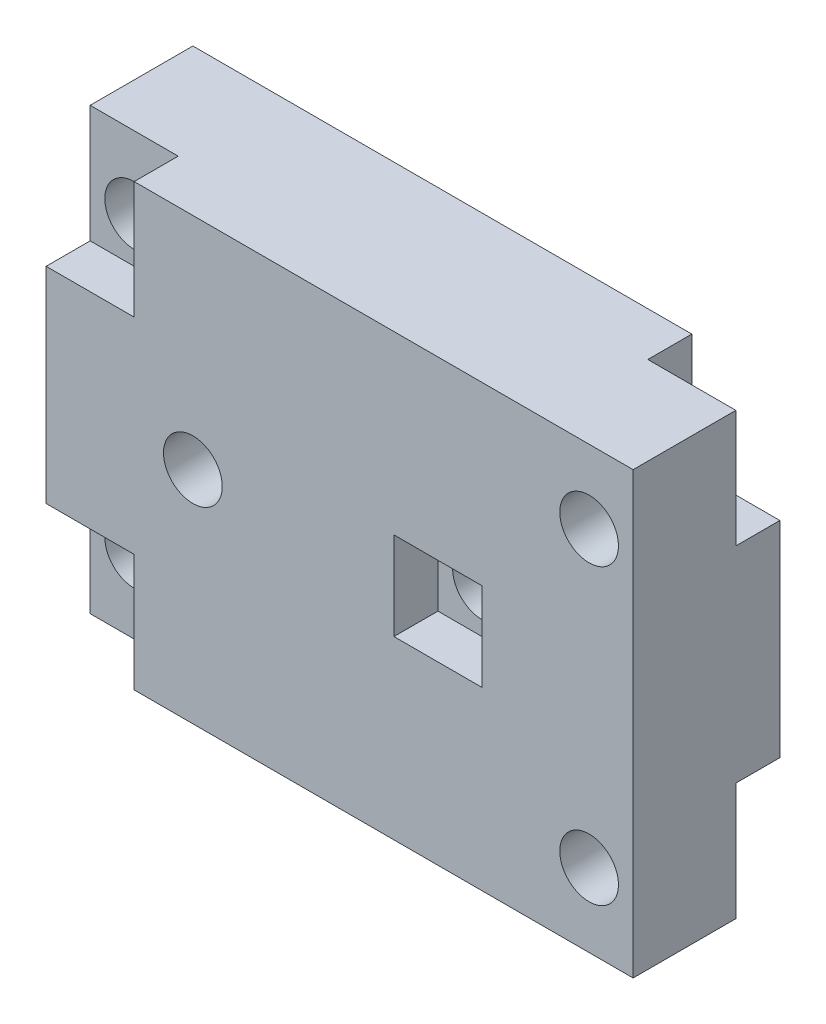
ISO-10303-21;
HEADER;
FILE_DESCRIPTION(('STEP AP214'),'2;1');
FILE_NAME('part.step','',(''),(''),'','','');
FILE_SCHEMA(('AUTOMOTIVE_DESIGN { 1 0 10303 214 1 1 1 1 }'));
ENDSEC;
DATA;
#1=APPLICATION_CONTEXT('core data for automotive mechanical design processes');
#2=APPLICATION_PROTOCOL_DEFINITION('international standard','automotive_design',2000,#1);
#3=PRODUCT_CONTEXT('',#1,'mechanical');
#4=PRODUCT('Part','Part','',(#3));
#5=PRODUCT_RELATED_PRODUCT_CATEGORY('part','',(#4));
#6=PRODUCT_DEFINITION_FORMATION('','',#4);
#7=PRODUCT_DEFINITION_CONTEXT('part definition',#1,'design');
#8=PRODUCT_DEFINITION('design','',#6,#7);
#9=PRODUCT_DEFINITION_SHAPE('','',#8);
#10=(LENGTH_UNIT() NAMED_UNIT(*) SI_UNIT(.MILLI.,.METRE.));
#11=(NAMED_UNIT(*) PLANE_ANGLE_UNIT() SI_UNIT($,.RADIAN.));
#12=(NAMED_UNIT(*) SI_UNIT($,.STERADIAN.) SOLID_ANGLE_UNIT());
#13=UNCERTAINTY_MEASURE_WITH_UNIT(LENGTH_MEASURE(1.E-05),#10,'distance_accuracy_value','');
#14=(GEOMETRIC_REPRESENTATION_CONTEXT(3) GLOBAL_UNCERTAINTY_ASSIGNED_CONTEXT((#13)) GLOBAL_UNIT_ASSIGNED_CONTEXT((#10,
#11,#12)) REPRESENTATION_CONTEXT('',''));
#15=CARTESIAN_POINT('',(0.,0.,0.));
#16=DIRECTION('',(0.,0.,1.));
#17=DIRECTION('',(1.,0.,0.));
#18=AXIS2_PLACEMENT_3D('',#15,#16,#17);
#19=CARTESIAN_POINT('',(37.,5.,7.));
#20=DIRECTION('',(0.,0.,-1.));
#21=DIRECTION('',(-1.,0.,0.));
#22=AXIS2_PLACEMENT_3D('',#19,#20,#21);
#23=CYLINDRICAL_SURFACE('',#22,2.);
#24=CARTESIAN_POINT('',(37.,5.,5.));
#25=DIRECTION('',(0.,0.,-1.));
#26=DIRECTION('',(-1.,0.,0.));
#27=AXIS2_PLACEMENT_3D('',#24,#25,#26);
#28=CIRCLE('',#27,2.);
#29=CARTESIAN_POINT('',(35.,5.,5.));
#30=VERTEX_POINT('',#29);
#31=EDGE_CURVE('E440',#30,#30,#28,.T.);
#32=ORIENTED_EDGE('',*,*,#31,.F.);
#33=EDGE_LOOP('',(#32));
#34=FACE_BOUND('',#33,.T.);
#35=CARTESIAN_POINT('',(37.,5.,-2.));
#36=DIRECTION('',(0.,0.,-1.));
#37=DIRECTION('',(-1.,0.,0.));
#38=AXIS2_PLACEMENT_3D('',#35,#36,#37);
#39=CIRCLE('',#38,2.);
#40=CARTESIAN_POINT('',(35.,5.,-2.));
#41=VERTEX_POINT('',#40);
#42=EDGE_CURVE('E446',#41,#41,#39,.F.);
#43=ORIENTED_EDGE('',*,*,#42,.F.);
#44=EDGE_LOOP('',(#43));
#45=FACE_BOUND('',#44,.T.);
#46=ADVANCED_FACE('F78',(#34,#45),#23,.F.);
#47=CARTESIAN_POINT('',(3.,25.,0.));
#48=DIRECTION('',(0.,0.,1.));
#49=DIRECTION('',(1.,0.,0.));
#50=AXIS2_PLACEMENT_3D('',#47,#48,#49);
#51=CYLINDRICAL_SURFACE('',#50,2.);
#52=CARTESIAN_POINT('',(3.,25.,2.));
#53=DIRECTION('',(0.,0.,1.));
#54=DIRECTION('',(1.,0.,0.));
#55=AXIS2_PLACEMENT_3D('',#52,#53,#54);
#56=CIRCLE('',#55,2.);
#57=CARTESIAN_POINT('',(5.,25.,2.));
#58=VERTEX_POINT('',#57);
#59=EDGE_CURVE('E389',#58,#58,#56,.F.);
#60=ORIENTED_EDGE('',*,*,#59,.F.);
#61=EDGE_LOOP('',(#60));
#62=FACE_BOUND('',#61,.T.);
#63=CARTESIAN_POINT('',(3.,25.,-5.));
#64=DIRECTION('',(0.,0.,-1.));
#65=DIRECTION('',(-1.,0.,0.));
#66=AXIS2_PLACEMENT_3D('',#63,#64,#65);
#67=CIRCLE('',#66,2.);
#68=CARTESIAN_POINT('',(1.,25.,-5.));
#69=VERTEX_POINT('',#68);
#70=EDGE_CURVE('E347',#69,#69,#67,.F.);
#71=ORIENTED_EDGE('',*,*,#70,.F.);
#72=EDGE_LOOP('',(#71));
#73=FACE_BOUND('',#72,.T.);
#74=ADVANCED_FACE('F473',(#62,#73),#51,.F.);
#75=CARTESIAN_POINT('',(26.7,15.,0.));
#76=DIRECTION('',(0.,0.,1.));
#77=DIRECTION('',(1.,0.,0.));
#78=AXIS2_PLACEMENT_3D('',#75,#76,#77);
#79=CYLINDRICAL_SURFACE('',#78,2.);
#80=CARTESIAN_POINT('',(26.7,15.,2.));
#81=DIRECTION('',(0.,0.,1.));
#82=DIRECTION('',(1.,0.,0.));
#83=AXIS2_PLACEMENT_3D('',#80,#81,#82);
#84=CIRCLE('',#83,2.);
#85=CARTESIAN_POINT('',(28.7,15.,2.));
#86=VERTEX_POINT('',#85);
#87=EDGE_CURVE('E392',#86,#86,#84,.F.);
#88=ORIENTED_EDGE('',*,*,#87,.F.);
#89=EDGE_LOOP('',(#88));
#90=FACE_BOUND('',#89,.T.);
#91=CARTESIAN_POINT('',(26.7,15.,-5.));
#92=DIRECTION('',(0.,0.,-1.));
#93=DIRECTION('',(-1.,0.,0.));
#94=AXIS2_PLACEMENT_3D('',#91,#92,#93);
#95=CIRCLE('',#94,2.);
#96=CARTESIAN_POINT('',(24.7,15.,-5.));
#97=VERTEX_POINT('',#96);
#98=EDGE_CURVE('E351',#97,#97,#95,.F.);
#99=ORIENTED_EDGE('',*,*,#98,.F.);
#100=EDGE_LOOP('',(#99));
#101=FACE_BOUND('',#100,.T.);
#102=ADVANCED_FACE('F479',(#90,#101),#79,.F.);
#103=CARTESIAN_POINT('',(3.,5.,0.));
#104=DIRECTION('',(0.,0.,1.));
#105=DIRECTION('',(1.,0.,0.));
#106=AXIS2_PLACEMENT_3D('',#103,#104,#105);
#107=CYLINDRICAL_SURFACE('',#106,2.);
#108=CARTESIAN_POINT('',(3.,5.,2.));
#109=DIRECTION('',(0.,0.,1.));
#110=DIRECTION('',(1.,0.,0.));
#111=AXIS2_PLACEMENT_3D('',#108,#109,#110);
#112=CIRCLE('',#111,2.);
#113=CARTESIAN_POINT('',(5.,5.,2.));
#114=VERTEX_POINT('',#113);
#115=EDGE_CURVE('E377',#114,#114,#112,.F.);
#116=ORIENTED_EDGE('',*,*,#115,.F.);
#117=EDGE_LOOP('',(#116));
#118=FACE_BOUND('',#117,.T.);
#119=CARTESIAN_POINT('',(3.,5.,-5.));
#120=DIRECTION('',(0.,0.,-1.));
#121=DIRECTION('',(-1.,0.,0.));
#122=AXIS2_PLACEMENT_3D('',#119,#120,#121);
#123=CIRCLE('',#122,2.);
#124=CARTESIAN_POINT('',(1.,5.,-5.));
#125=VERTEX_POINT('',#124);
#126=EDGE_CURVE('E344',#125,#125,#123,.F.);
#127=ORIENTED_EDGE('',*,*,#126,.F.);
#128=EDGE_LOOP('',(#127));
#129=FACE_BOUND('',#128,.T.);
#130=ADVANCED_FACE('F521',(#118,#129),#107,.F.);
#131=CARTESIAN_POINT('',(40.,0.,5.));
#132=DIRECTION('',(0.,1.,0.));
#133=DIRECTION('',(0.,0.,1.));
#134=AXIS2_PLACEMENT_3D('',#131,#132,#133);
#135=PLANE('',#134);
#136=DIRECTION('',(-1.,0.,0.));
#137=VECTOR('',#136,1.);
#138=CARTESIAN_POINT('',(40.,0.,-5.));
#139=LINE('',#138,#137);
#140=CARTESIAN_POINT('',(34.,0.,-5.));
#141=VERTEX_POINT('',#140);
#142=CARTESIAN_POINT('',(0.,0.,-5.));
#143=VERTEX_POINT('',#142);
#144=EDGE_CURVE('E357',#141,#143,#139,.T.);
#145=ORIENTED_EDGE('',*,*,#144,.F.);
#146=DIRECTION('',(0.,0.,-1.));
#147=VECTOR('',#146,1.);
#148=CARTESIAN_POINT('',(34.,0.,-2.));
#149=LINE('',#148,#147);
#150=CARTESIAN_POINT('',(34.,0.,-2.));
#151=VERTEX_POINT('',#150);
#152=EDGE_CURVE('E308',#151,#141,#149,.T.);
#153=ORIENTED_EDGE('',*,*,#152,.F.);
#154=DIRECTION('',(-1.,0.,0.));
#155=VECTOR('',#154,1.);
#156=CARTESIAN_POINT('',(40.,0.,-2.));
#157=LINE('',#156,#155);
#158=CARTESIAN_POINT('',(40.,0.,-2.));
#159=VERTEX_POINT('',#158);
#160=EDGE_CURVE('E296',#159,#151,#157,.T.);
#161=ORIENTED_EDGE('',*,*,#160,.F.);
#162=DIRECTION('',(0.,0.,-1.));
#163=VECTOR('',#162,1.);
#164=CARTESIAN_POINT('',(40.,0.,5.));
#165=LINE('',#164,#163);
#166=CARTESIAN_POINT('',(40.,0.,5.));
#167=VERTEX_POINT('',#166);
#168=EDGE_CURVE('E12',#167,#159,#165,.T.);
#169=ORIENTED_EDGE('',*,*,#168,.F.);
#170=DIRECTION('',(1.,0.,0.));
#171=VECTOR('',#170,1.);
#172=CARTESIAN_POINT('',(40.,0.,5.));
#173=LINE('',#172,#171);
#174=CARTESIAN_POINT('',(6.,0.,5.));
#175=VERTEX_POINT('',#174);
#176=EDGE_CURVE('E402',#175,#167,#173,.T.);
#177=ORIENTED_EDGE('',*,*,#176,.F.);
#178=DIRECTION('',(0.,0.,1.));
#179=VECTOR('',#178,1.);
#180=CARTESIAN_POINT('',(6.,0.,2.5));
#181=LINE('',#180,#179);
#182=CARTESIAN_POINT('',(6.,0.,2.));
#183=VERTEX_POINT('',#182);
#184=EDGE_CURVE('E414',#183,#175,#181,.T.);
#185=ORIENTED_EDGE('',*,*,#184,.F.);
#186=DIRECTION('',(1.,0.,0.));
#187=VECTOR('',#186,1.);
#188=CARTESIAN_POINT('',(0.,0.,2.));
#189=LINE('',#188,#187);
#190=CARTESIAN_POINT('',(0.,0.,2.));
#191=VERTEX_POINT('',#190);
#192=EDGE_CURVE('E382',#191,#183,#189,.T.);
#193=ORIENTED_EDGE('',*,*,#192,.F.);
#194=DIRECTION('',(0.,0.,-1.));
#195=VECTOR('',#194,1.);
#196=CARTESIAN_POINT('',(0.,0.,5.));
#197=LINE('',#196,#195);
#198=EDGE_CURVE('E427',#191,#143,#197,.T.);
#199=ORIENTED_EDGE('',*,*,#198,.T.);
#200=EDGE_LOOP('',(#145,#153,#161,#169,#177,#185,#193,#199));
#201=FACE_BOUND('',#200,.T.);
#202=ADVANCED_FACE('F80',(#201),#135,.F.);
#203=CARTESIAN_POINT('',(40.,30.,5.));
#204=DIRECTION('',(-1.,0.,0.));
#205=DIRECTION('',(0.,0.,1.));
#206=AXIS2_PLACEMENT_3D('',#203,#204,#205);
#207=PLANE('',#206);
#208=DIRECTION('',(0.,-1.,0.));
#209=VECTOR('',#208,1.);
#210=CARTESIAN_POINT('',(40.,30.,-5.));
#211=LINE('',#210,#209);
#212=CARTESIAN_POINT('',(40.,22.,-5.));
#213=VERTEX_POINT('',#212);
#214=CARTESIAN_POINT('',(40.,8.,-5.));
#215=VERTEX_POINT('',#214);
#216=EDGE_CURVE('E354',#213,#215,#211,.T.);
#217=ORIENTED_EDGE('',*,*,#216,.F.);
#218=DIRECTION('',(0.,0.,-1.));
#219=VECTOR('',#218,1.);
#220=CARTESIAN_POINT('',(40.,22.,-2.));
#221=LINE('',#220,#219);
#222=CARTESIAN_POINT('',(40.,22.,-2.));
#223=VERTEX_POINT('',#222);
#224=EDGE_CURVE('E284',#223,#213,#221,.T.);
#225=ORIENTED_EDGE('',*,*,#224,.F.);
#226=DIRECTION('',(0.,-1.,0.));
#227=VECTOR('',#226,1.);
#228=CARTESIAN_POINT('',(40.,22.,-2.));
#229=LINE('',#228,#227);
#230=CARTESIAN_POINT('',(40.,30.,-2.));
#231=VERTEX_POINT('',#230);
#232=EDGE_CURVE('E277',#231,#223,#229,.T.);
#233=ORIENTED_EDGE('',*,*,#232,.F.);
#234=DIRECTION('',(0.,0.,-1.));
#235=VECTOR('',#234,1.);
#236=CARTESIAN_POINT('',(40.,30.,5.));
#237=LINE('',#236,#235);
#238=CARTESIAN_POINT('',(40.,30.,5.));
#239=VERTEX_POINT('',#238);
#240=EDGE_CURVE('E87',#239,#231,#237,.T.);
#241=ORIENTED_EDGE('',*,*,#240,.F.);
#242=DIRECTION('',(0.,1.,0.));
#243=VECTOR('',#242,1.);
#244=CARTESIAN_POINT('',(40.,30.,5.));
#245=LINE('',#244,#243);
#246=EDGE_CURVE('E419',#167,#239,#245,.T.);
#247=ORIENTED_EDGE('',*,*,#246,.F.);
#248=ORIENTED_EDGE('',*,*,#168,.T.);
#249=DIRECTION('',(0.,-1.,0.));
#250=VECTOR('',#249,1.);
#251=CARTESIAN_POINT('',(40.,8.,-2.));
#252=LINE('',#251,#250);
#253=CARTESIAN_POINT('',(40.,8.,-2.));
#254=VERTEX_POINT('',#253);
#255=EDGE_CURVE('E293',#254,#159,#252,.T.);
#256=ORIENTED_EDGE('',*,*,#255,.F.);
#257=DIRECTION('',(0.,0.,-1.));
#258=VECTOR('',#257,1.);
#259=CARTESIAN_POINT('',(40.,8.,-2.));
#260=LINE('',#259,#258);
#261=EDGE_CURVE('E301',#254,#215,#260,.T.);
#262=ORIENTED_EDGE('',*,*,#261,.T.);
#263=EDGE_LOOP('',(#217,#225,#233,#241,#247,#248,#256,#262));
#264=FACE_BOUND('',#263,.T.);
#265=ADVANCED_FACE('F537',(#264),#207,.F.);
#266=CARTESIAN_POINT('',(0.,30.,5.));
#267=DIRECTION('',(0.,-1.,0.));
#268=DIRECTION('',(0.,0.,-1.));
#269=AXIS2_PLACEMENT_3D('',#266,#267,#268);
#270=PLANE('',#269);
#271=DIRECTION('',(1.,0.,0.));
#272=VECTOR('',#271,1.);
#273=CARTESIAN_POINT('',(40.,30.,-2.));
#274=LINE('',#273,#272);
#275=CARTESIAN_POINT('',(34.,30.,-2.));
#276=VERTEX_POINT('',#275);
#277=EDGE_CURVE('E275',#276,#231,#274,.T.);
#278=ORIENTED_EDGE('',*,*,#277,.F.);
#279=DIRECTION('',(0.,0.,-1.));
#280=VECTOR('',#279,1.);
#281=CARTESIAN_POINT('',(34.,30.,-2.));
#282=LINE('',#281,#280);
#283=CARTESIAN_POINT('',(34.,30.,-5.));
#284=VERTEX_POINT('',#283);
#285=EDGE_CURVE('E287',#276,#284,#282,.T.);
#286=ORIENTED_EDGE('',*,*,#285,.T.);
#287=DIRECTION('',(-1.,0.,0.));
#288=VECTOR('',#287,1.);
#289=CARTESIAN_POINT('',(40.,30.,-5.));
#290=LINE('',#289,#288);
#291=CARTESIAN_POINT('',(0.,30.,-5.));
#292=VERTEX_POINT('',#291);
#293=EDGE_CURVE('E362',#284,#292,#290,.T.);
#294=ORIENTED_EDGE('',*,*,#293,.T.);
#295=DIRECTION('',(0.,0.,-1.));
#296=VECTOR('',#295,1.);
#297=CARTESIAN_POINT('',(0.,30.,5.));
#298=LINE('',#297,#296);
#299=CARTESIAN_POINT('',(0.,30.,2.));
#300=VERTEX_POINT('',#299);
#301=EDGE_CURVE('E430',#300,#292,#298,.T.);
#302=ORIENTED_EDGE('',*,*,#301,.F.);
#303=DIRECTION('',(-1.,0.,0.));
#304=VECTOR('',#303,1.);
#305=CARTESIAN_POINT('',(6.,30.,2.));
#306=LINE('',#305,#304);
#307=CARTESIAN_POINT('',(6.,30.,2.));
#308=VERTEX_POINT('',#307);
#309=EDGE_CURVE('E372',#308,#300,#306,.T.);
#310=ORIENTED_EDGE('',*,*,#309,.F.);
#311=DIRECTION('',(0.,0.,1.));
#312=VECTOR('',#311,1.);
#313=CARTESIAN_POINT('',(6.,30.,2.5));
#314=LINE('',#313,#312);
#315=CARTESIAN_POINT('',(6.,30.,5.));
#316=VERTEX_POINT('',#315);
#317=EDGE_CURVE('E403',#308,#316,#314,.T.);
#318=ORIENTED_EDGE('',*,*,#317,.T.);
#319=DIRECTION('',(-1.,0.,0.));
#320=VECTOR('',#319,1.);
#321=CARTESIAN_POINT('',(0.,30.,5.));
#322=LINE('',#321,#320);
#323=EDGE_CURVE('E421',#239,#316,#322,.T.);
#324=ORIENTED_EDGE('',*,*,#323,.F.);
#325=ORIENTED_EDGE('',*,*,#240,.T.);
#326=EDGE_LOOP('',(#278,#286,#294,#302,#310,#318,#324,#325));
#327=FACE_BOUND('',#326,.T.);
#328=ADVANCED_FACE('F534',(#327),#270,.F.);
#329=CARTESIAN_POINT('',(0.,0.,5.));
#330=DIRECTION('',(1.,0.,0.));
#331=DIRECTION('',(0.,0.,-1.));
#332=AXIS2_PLACEMENT_3D('',#329,#330,#331);
#333=PLANE('',#332);
#334=DIRECTION('',(0.,0.,1.));
#335=VECTOR('',#334,1.);
#336=CARTESIAN_POINT('',(0.,22.,2.5));
#337=LINE('',#336,#335);
#338=CARTESIAN_POINT('',(0.,22.,2.));
#339=VERTEX_POINT('',#338);
#340=CARTESIAN_POINT('',(0.,22.,5.));
#341=VERTEX_POINT('',#340);
#342=EDGE_CURVE('E400',#339,#341,#337,.T.);
#343=ORIENTED_EDGE('',*,*,#342,.F.);
#344=DIRECTION('',(0.,-1.,0.));
#345=VECTOR('',#344,1.);
#346=CARTESIAN_POINT('',(0.,30.,2.));
#347=LINE('',#346,#345);
#348=EDGE_CURVE('E374',#300,#339,#347,.T.);
#349=ORIENTED_EDGE('',*,*,#348,.F.);
#350=ORIENTED_EDGE('',*,*,#301,.T.);
#351=DIRECTION('',(0.,-1.,0.));
#352=VECTOR('',#351,1.);
#353=CARTESIAN_POINT('',(0.,30.,-5.));
#354=LINE('',#353,#352);
#355=EDGE_CURVE('E359',#292,#143,#354,.T.);
#356=ORIENTED_EDGE('',*,*,#355,.T.);
#357=ORIENTED_EDGE('',*,*,#198,.F.);
#358=DIRECTION('',(0.,-1.,0.));
#359=VECTOR('',#358,1.);
#360=CARTESIAN_POINT('',(0.,8.,2.));
#361=LINE('',#360,#359);
#362=CARTESIAN_POINT('',(0.,8.,2.));
#363=VERTEX_POINT('',#362);
#364=EDGE_CURVE('E380',#363,#191,#361,.T.);
#365=ORIENTED_EDGE('',*,*,#364,.F.);
#366=DIRECTION('',(0.,0.,1.));
#367=VECTOR('',#366,1.);
#368=CARTESIAN_POINT('',(0.,8.,2.5));
#369=LINE('',#368,#367);
#370=CARTESIAN_POINT('',(0.,8.,5.));
#371=VERTEX_POINT('',#370);
#372=EDGE_CURVE('E411',#363,#371,#369,.T.);
#373=ORIENTED_EDGE('',*,*,#372,.T.);
#374=DIRECTION('',(0.,-1.,0.));
#375=VECTOR('',#374,1.);
#376=CARTESIAN_POINT('',(0.,0.,5.));
#377=LINE('',#376,#375);
#378=EDGE_CURVE('E424',#341,#371,#377,.T.);
#379=ORIENTED_EDGE('',*,*,#378,.F.);
#380=EDGE_LOOP('',(#343,#349,#350,#356,#357,#365,#373,#379));
#381=FACE_BOUND('',#380,.T.);
#382=ADVANCED_FACE('F530',(#381),#333,.F.);
#383=CARTESIAN_POINT('',(0.,0.,5.));
#384=DIRECTION('',(0.,0.,-1.));
#385=DIRECTION('',(-1.,0.,0.));
#386=AXIS2_PLACEMENT_3D('',#383,#384,#385);
#387=PLANE('',#386);
#388=CARTESIAN_POINT('',(37.,25.,5.));
#389=DIRECTION('',(0.,0.,-1.));
#390=DIRECTION('',(-1.,0.,0.));
#391=AXIS2_PLACEMENT_3D('',#388,#389,#390);
#392=CIRCLE('',#391,2.);
#393=CARTESIAN_POINT('',(35.,25.,5.));
#394=VERTEX_POINT('',#393);
#395=EDGE_CURVE('E348',#394,#394,#392,.T.);
#396=ORIENTED_EDGE('',*,*,#395,.T.);
#397=EDGE_LOOP('',(#396));
#398=FACE_BOUND('',#397,.T.);
#399=ORIENTED_EDGE('',*,*,#31,.T.);
#400=EDGE_LOOP('',(#399));
#401=FACE_BOUND('',#400,.T.);
#402=CARTESIAN_POINT('',(10.,15.,5.));
#403=DIRECTION('',(0.,0.,-1.));
#404=DIRECTION('',(-1.,0.,0.));
#405=AXIS2_PLACEMENT_3D('',#402,#403,#404);
#406=CIRCLE('',#405,2.);
#407=CARTESIAN_POINT('',(8.,15.,5.));
#408=VERTEX_POINT('',#407);
#409=EDGE_CURVE('E437',#408,#408,#406,.T.);
#410=ORIENTED_EDGE('',*,*,#409,.T.);
#411=EDGE_LOOP('',(#410));
#412=FACE_BOUND('',#411,.T.);
#413=DIRECTION('',(0.,-1.,0.));
#414=VECTOR('',#413,1.);
#415=CARTESIAN_POINT('',(23.7,12.,5.));
#416=LINE('',#415,#414);
#417=CARTESIAN_POINT('',(23.7,18.,5.));
#418=VERTEX_POINT('',#417);
#419=CARTESIAN_POINT('',(23.7,12.,5.));
#420=VERTEX_POINT('',#419);
#421=EDGE_CURVE('E717',#418,#420,#416,.T.);
#422=ORIENTED_EDGE('',*,*,#421,.F.);
#423=DIRECTION('',(-1.,0.,0.));
#424=VECTOR('',#423,1.);
#425=CARTESIAN_POINT('',(26.7,18.,5.));
#426=LINE('',#425,#424);
#427=CARTESIAN_POINT('',(29.7,18.,5.));
#428=VERTEX_POINT('',#427);
#429=EDGE_CURVE('E95',#428,#418,#426,.T.);
#430=ORIENTED_EDGE('',*,*,#429,.F.);
#431=DIRECTION('',(0.,1.,0.));
#432=VECTOR('',#431,1.);
#433=CARTESIAN_POINT('',(29.7,18.,5.));
#434=LINE('',#433,#432);
#435=CARTESIAN_POINT('',(29.7,12.,5.));
#436=VERTEX_POINT('',#435);
#437=EDGE_CURVE('E721',#436,#428,#434,.T.);
#438=ORIENTED_EDGE('',*,*,#437,.F.);
#439=DIRECTION('',(1.,0.,0.));
#440=VECTOR('',#439,1.);
#441=CARTESIAN_POINT('',(29.7,12.,5.));
#442=LINE('',#441,#440);
#443=EDGE_CURVE('E719',#420,#436,#442,.T.);
#444=ORIENTED_EDGE('',*,*,#443,.F.);
#445=EDGE_LOOP('',(#422,#430,#438,#444));
#446=FACE_BOUND('',#445,.T.);
#447=ORIENTED_EDGE('',*,*,#323,.T.);
#448=DIRECTION('',(0.,1.,0.));
#449=VECTOR('',#448,1.);
#450=CARTESIAN_POINT('',(6.,22.,5.));
#451=LINE('',#450,#449);
#452=CARTESIAN_POINT('',(6.,22.,5.));
#453=VERTEX_POINT('',#452);
#454=EDGE_CURVE('E396',#453,#316,#451,.T.);
#455=ORIENTED_EDGE('',*,*,#454,.F.);
#456=DIRECTION('',(1.,0.,0.));
#457=VECTOR('',#456,1.);
#458=CARTESIAN_POINT('',(3.,22.,5.));
#459=LINE('',#458,#457);
#460=EDGE_CURVE('E393',#341,#453,#459,.T.);
#461=ORIENTED_EDGE('',*,*,#460,.F.);
#462=ORIENTED_EDGE('',*,*,#378,.T.);
#463=DIRECTION('',(-1.,0.,0.));
#464=VECTOR('',#463,1.);
#465=CARTESIAN_POINT('',(3.,8.,5.));
#466=LINE('',#465,#464);
#467=CARTESIAN_POINT('',(6.,8.,5.));
#468=VERTEX_POINT('',#467);
#469=EDGE_CURVE('E407',#468,#371,#466,.T.);
#470=ORIENTED_EDGE('',*,*,#469,.F.);
#471=DIRECTION('',(0.,1.,0.));
#472=VECTOR('',#471,1.);
#473=CARTESIAN_POINT('',(6.,0.,5.));
#474=LINE('',#473,#472);
#475=EDGE_CURVE('E409',#175,#468,#474,.T.);
#476=ORIENTED_EDGE('',*,*,#475,.F.);
#477=ORIENTED_EDGE('',*,*,#176,.T.);
#478=ORIENTED_EDGE('',*,*,#246,.T.);
#479=EDGE_LOOP('',(#447,#455,#461,#462,#470,#476,#477,#478));
#480=FACE_BOUND('',#479,.T.);
#481=ADVANCED_FACE('F516',(#398,#401,#412,#446,#480),#387,.F.);
#482=CARTESIAN_POINT('',(6.,0.,2.5));
#483=DIRECTION('',(1.,0.,0.));
#484=DIRECTION('',(0.,0.,-1.));
#485=AXIS2_PLACEMENT_3D('',#482,#483,#484);
#486=PLANE('',#485);
#487=ORIENTED_EDGE('',*,*,#475,.T.);
#488=DIRECTION('',(0.,0.,1.));
#489=VECTOR('',#488,1.);
#490=CARTESIAN_POINT('',(6.,8.,2.5));
#491=LINE('',#490,#489);
#492=CARTESIAN_POINT('',(6.,8.,2.));
#493=VERTEX_POINT('',#492);
#494=EDGE_CURVE('E397',#493,#468,#491,.T.);
#495=ORIENTED_EDGE('',*,*,#494,.F.);
#496=DIRECTION('',(0.,1.,0.));
#497=VECTOR('',#496,1.);
#498=CARTESIAN_POINT('',(6.,0.,2.));
#499=LINE('',#498,#497);
#500=EDGE_CURVE('E369',#183,#493,#499,.T.);
#501=ORIENTED_EDGE('',*,*,#500,.F.);
#502=ORIENTED_EDGE('',*,*,#184,.T.);
#503=EDGE_LOOP('',(#487,#495,#501,#502));
#504=FACE_BOUND('',#503,.T.);
#505=ADVANCED_FACE('F513',(#504),#486,.F.);
#506=CARTESIAN_POINT('',(3.,8.,2.5));
#507=DIRECTION('',(0.,1.,0.));
#508=DIRECTION('',(0.,0.,1.));
#509=AXIS2_PLACEMENT_3D('',#506,#507,#508);
#510=PLANE('',#509);
#511=ORIENTED_EDGE('',*,*,#469,.T.);
#512=ORIENTED_EDGE('',*,*,#372,.F.);
#513=DIRECTION('',(-1.,0.,0.));
#514=VECTOR('',#513,1.);
#515=CARTESIAN_POINT('',(6.,8.,2.));
#516=LINE('',#515,#514);
#517=EDGE_CURVE('E364',#493,#363,#516,.T.);
#518=ORIENTED_EDGE('',*,*,#517,.F.);
#519=ORIENTED_EDGE('',*,*,#494,.T.);
#520=EDGE_LOOP('',(#511,#512,#518,#519));
#521=FACE_BOUND('',#520,.T.);
#522=ADVANCED_FACE('F508',(#521),#510,.F.);
#523=CARTESIAN_POINT('',(6.,22.,2.5));
#524=DIRECTION('',(1.,0.,0.));
#525=DIRECTION('',(0.,1.,0.));
#526=AXIS2_PLACEMENT_3D('',#523,#524,#525);
#527=PLANE('',#526);
#528=ORIENTED_EDGE('',*,*,#454,.T.);
#529=ORIENTED_EDGE('',*,*,#317,.F.);
#530=DIRECTION('',(0.,1.,0.));
#531=VECTOR('',#530,1.);
#532=CARTESIAN_POINT('',(6.,22.,2.));
#533=LINE('',#532,#531);
#534=CARTESIAN_POINT('',(6.,22.,2.));
#535=VERTEX_POINT('',#534);
#536=EDGE_CURVE('E368',#535,#308,#533,.T.);
#537=ORIENTED_EDGE('',*,*,#536,.F.);
#538=DIRECTION('',(0.,0.,1.));
#539=VECTOR('',#538,1.);
#540=CARTESIAN_POINT('',(6.,22.,2.5));
#541=LINE('',#540,#539);
#542=EDGE_CURVE('E399',#535,#453,#541,.T.);
#543=ORIENTED_EDGE('',*,*,#542,.T.);
#544=EDGE_LOOP('',(#528,#529,#537,#543));
#545=FACE_BOUND('',#544,.T.);
#546=ADVANCED_FACE('F505',(#545),#527,.F.);
#547=CARTESIAN_POINT('',(3.,22.,2.5));
#548=DIRECTION('',(0.,-1.,0.));
#549=DIRECTION('',(0.,0.,-1.));
#550=AXIS2_PLACEMENT_3D('',#547,#548,#549);
#551=PLANE('',#550);
#552=ORIENTED_EDGE('',*,*,#460,.T.);
#553=ORIENTED_EDGE('',*,*,#542,.F.);
#554=DIRECTION('',(1.,0.,0.));
#555=VECTOR('',#554,1.);
#556=CARTESIAN_POINT('',(0.,22.,2.));
#557=LINE('',#556,#555);
#558=EDGE_CURVE('E365',#339,#535,#557,.T.);
#559=ORIENTED_EDGE('',*,*,#558,.F.);
#560=ORIENTED_EDGE('',*,*,#342,.T.);
#561=EDGE_LOOP('',(#552,#553,#559,#560));
#562=FACE_BOUND('',#561,.T.);
#563=ADVANCED_FACE('F498',(#562),#551,.F.);
#564=CARTESIAN_POINT('',(0.,0.,2.));
#565=DIRECTION('',(0.,0.,1.));
#566=DIRECTION('',(1.,0.,0.));
#567=AXIS2_PLACEMENT_3D('',#564,#565,#566);
#568=PLANE('',#567);
#569=ORIENTED_EDGE('',*,*,#558,.T.);
#570=ORIENTED_EDGE('',*,*,#536,.T.);
#571=ORIENTED_EDGE('',*,*,#309,.T.);
#572=ORIENTED_EDGE('',*,*,#348,.T.);
#573=EDGE_LOOP('',(#569,#570,#571,#572));
#574=FACE_BOUND('',#573,.T.);
#575=ORIENTED_EDGE('',*,*,#59,.T.);
#576=EDGE_LOOP('',(#575));
#577=FACE_BOUND('',#576,.T.);
#578=ADVANCED_FACE('F495',(#574,#577),#568,.T.);
#579=CARTESIAN_POINT('',(26.7,15.,2.));
#580=DIRECTION('',(0.,0.,1.));
#581=DIRECTION('',(1.,0.,0.));
#582=AXIS2_PLACEMENT_3D('',#579,#580,#581);
#583=PLANE('',#582);
#584=DIRECTION('',(-1.,0.,0.));
#585=VECTOR('',#584,1.);
#586=CARTESIAN_POINT('',(23.7,18.,2.));
#587=LINE('',#586,#585);
#588=CARTESIAN_POINT('',(29.7,18.,2.));
#589=VERTEX_POINT('',#588);
#590=CARTESIAN_POINT('',(23.7,18.,2.));
#591=VERTEX_POINT('',#590);
#592=EDGE_CURVE('E253',#589,#591,#587,.T.);
#593=ORIENTED_EDGE('',*,*,#592,.T.);
#594=DIRECTION('',(0.,-1.,0.));
#595=VECTOR('',#594,1.);
#596=CARTESIAN_POINT('',(23.7,12.,2.));
#597=LINE('',#596,#595);
#598=CARTESIAN_POINT('',(23.7,12.,2.));
#599=VERTEX_POINT('',#598);
#600=EDGE_CURVE('E244',#591,#599,#597,.T.);
#601=ORIENTED_EDGE('',*,*,#600,.T.);
#602=DIRECTION('',(1.,0.,0.));
#603=VECTOR('',#602,1.);
#604=CARTESIAN_POINT('',(29.7,12.,2.));
#605=LINE('',#604,#603);
#606=CARTESIAN_POINT('',(29.7,12.,2.));
#607=VERTEX_POINT('',#606);
#608=EDGE_CURVE('E252',#599,#607,#605,.T.);
#609=ORIENTED_EDGE('',*,*,#608,.T.);
#610=DIRECTION('',(0.,1.,0.));
#611=VECTOR('',#610,1.);
#612=CARTESIAN_POINT('',(29.7,18.,2.));
#613=LINE('',#612,#611);
#614=EDGE_CURVE('E258',#607,#589,#613,.T.);
#615=ORIENTED_EDGE('',*,*,#614,.T.);
#616=EDGE_LOOP('',(#593,#601,#609,#615));
#617=FACE_BOUND('',#616,.T.);
#618=ORIENTED_EDGE('',*,*,#87,.T.);
#619=EDGE_LOOP('',(#618));
#620=FACE_BOUND('',#619,.T.);
#621=ADVANCED_FACE('F256',(#617,#620),#583,.T.);
#622=CARTESIAN_POINT('',(0.,0.,2.));
#623=DIRECTION('',(0.,0.,1.));
#624=DIRECTION('',(1.,0.,0.));
#625=AXIS2_PLACEMENT_3D('',#622,#623,#624);
#626=PLANE('',#625);
#627=ORIENTED_EDGE('',*,*,#517,.T.);
#628=ORIENTED_EDGE('',*,*,#364,.T.);
#629=ORIENTED_EDGE('',*,*,#192,.T.);
#630=ORIENTED_EDGE('',*,*,#500,.T.);
#631=EDGE_LOOP('',(#627,#628,#629,#630));
#632=FACE_BOUND('',#631,.T.);
#633=ORIENTED_EDGE('',*,*,#115,.T.);
#634=EDGE_LOOP('',(#633));
#635=FACE_BOUND('',#634,.T.);
#636=ADVANCED_FACE('F493',(#632,#635),#626,.T.);
#637=CARTESIAN_POINT('',(0.,0.,-5.));
#638=DIRECTION('',(0.,0.,-1.));
#639=DIRECTION('',(-1.,0.,0.));
#640=AXIS2_PLACEMENT_3D('',#637,#638,#639);
#641=PLANE('',#640);
#642=DIRECTION('',(-1.,0.,0.));
#643=VECTOR('',#642,1.);
#644=CARTESIAN_POINT('',(37.,22.,-5.));
#645=LINE('',#644,#643);
#646=CARTESIAN_POINT('',(34.,22.,-5.));
#647=VERTEX_POINT('',#646);
#648=EDGE_CURVE('E272',#213,#647,#645,.T.);
#649=ORIENTED_EDGE('',*,*,#648,.F.);
#650=ORIENTED_EDGE('',*,*,#216,.T.);
#651=DIRECTION('',(1.,0.,0.));
#652=VECTOR('',#651,1.);
#653=CARTESIAN_POINT('',(37.,8.,-5.));
#654=LINE('',#653,#652);
#655=CARTESIAN_POINT('',(34.,8.,-5.));
#656=VERTEX_POINT('',#655);
#657=EDGE_CURVE('E302',#656,#215,#654,.T.);
#658=ORIENTED_EDGE('',*,*,#657,.F.);
#659=DIRECTION('',(0.,1.,0.));
#660=VECTOR('',#659,1.);
#661=CARTESIAN_POINT('',(34.,0.,-5.));
#662=LINE('',#661,#660);
#663=EDGE_CURVE('E294',#141,#656,#662,.T.);
#664=ORIENTED_EDGE('',*,*,#663,.F.);
#665=ORIENTED_EDGE('',*,*,#144,.T.);
#666=ORIENTED_EDGE('',*,*,#355,.F.);
#667=ORIENTED_EDGE('',*,*,#293,.F.);
#668=DIRECTION('',(0.,1.,0.));
#669=VECTOR('',#668,1.);
#670=CARTESIAN_POINT('',(34.,30.,-5.));
#671=LINE('',#670,#669);
#672=EDGE_CURVE('E280',#647,#284,#671,.T.);
#673=ORIENTED_EDGE('',*,*,#672,.F.);
#674=EDGE_LOOP('',(#649,#650,#658,#664,#665,#666,#667,#673));
#675=FACE_BOUND('',#674,.T.);
#676=DIRECTION('',(1.,0.,0.));
#677=VECTOR('',#676,1.);
#678=CARTESIAN_POINT('',(10.,18.,-5.));
#679=LINE('',#678,#677);
#680=CARTESIAN_POINT('',(7.,18.,-5.));
#681=VERTEX_POINT('',#680);
#682=CARTESIAN_POINT('',(13.,18.,-5.));
#683=VERTEX_POINT('',#682);
#684=EDGE_CURVE('E316',#681,#683,#679,.T.);
#685=ORIENTED_EDGE('',*,*,#684,.F.);
#686=DIRECTION('',(0.,1.,0.));
#687=VECTOR('',#686,1.);
#688=CARTESIAN_POINT('',(7.,18.,-5.));
#689=LINE('',#688,#687);
#690=CARTESIAN_POINT('',(7.,12.,-5.));
#691=VERTEX_POINT('',#690);
#692=EDGE_CURVE('E333',#691,#681,#689,.T.);
#693=ORIENTED_EDGE('',*,*,#692,.F.);
#694=DIRECTION('',(-1.,0.,0.));
#695=VECTOR('',#694,1.);
#696=CARTESIAN_POINT('',(7.,12.,-5.));
#697=LINE('',#696,#695);
#698=CARTESIAN_POINT('',(13.,12.,-5.));
#699=VERTEX_POINT('',#698);
#700=EDGE_CURVE('E329',#699,#691,#697,.T.);
#701=ORIENTED_EDGE('',*,*,#700,.F.);
#702=DIRECTION('',(0.,-1.,0.));
#703=VECTOR('',#702,1.);
#704=CARTESIAN_POINT('',(13.,12.,-5.));
#705=LINE('',#704,#703);
#706=EDGE_CURVE('E326',#683,#699,#705,.T.);
#707=ORIENTED_EDGE('',*,*,#706,.F.);
#708=EDGE_LOOP('',(#685,#693,#701,#707));
#709=FACE_BOUND('',#708,.T.);
#710=ORIENTED_EDGE('',*,*,#126,.T.);
#711=EDGE_LOOP('',(#710));
#712=FACE_BOUND('',#711,.T.);
#713=ORIENTED_EDGE('',*,*,#70,.T.);
#714=EDGE_LOOP('',(#713));
#715=FACE_BOUND('',#714,.T.);
#716=ORIENTED_EDGE('',*,*,#98,.T.);
#717=EDGE_LOOP('',(#716));
#718=FACE_BOUND('',#717,.T.);
#719=ADVANCED_FACE('F490',(#675,#709,#712,#715,#718),#641,.T.);
#720=CARTESIAN_POINT('',(10.,15.,7.));
#721=DIRECTION('',(0.,0.,-1.));
#722=DIRECTION('',(-1.,0.,0.));
#723=AXIS2_PLACEMENT_3D('',#720,#721,#722);
#724=CYLINDRICAL_SURFACE('',#723,2.);
#725=CARTESIAN_POINT('',(10.,15.,-2.));
#726=DIRECTION('',(0.,0.,1.));
#727=DIRECTION('',(1.,0.,0.));
#728=AXIS2_PLACEMENT_3D('',#725,#726,#727);
#729=CIRCLE('',#728,2.);
#730=CARTESIAN_POINT('',(12.,15.,-2.));
#731=VERTEX_POINT('',#730);
#732=EDGE_CURVE('E82',#731,#731,#729,.F.);
#733=ORIENTED_EDGE('',*,*,#732,.T.);
#734=EDGE_LOOP('',(#733));
#735=FACE_BOUND('',#734,.T.);
#736=ORIENTED_EDGE('',*,*,#409,.F.);
#737=EDGE_LOOP('',(#736));
#738=FACE_BOUND('',#737,.T.);
#739=ADVANCED_FACE('F453',(#735,#738),#724,.F.);
#740=CARTESIAN_POINT('',(37.,25.,7.));
#741=DIRECTION('',(0.,0.,-1.));
#742=DIRECTION('',(-1.,0.,0.));
#743=AXIS2_PLACEMENT_3D('',#740,#741,#742);
#744=CYLINDRICAL_SURFACE('',#743,2.);
#745=CARTESIAN_POINT('',(37.,25.,-2.));
#746=DIRECTION('',(0.,0.,1.));
#747=DIRECTION('',(1.,0.,0.));
#748=AXIS2_PLACEMENT_3D('',#745,#746,#747);
#749=CIRCLE('',#748,2.);
#750=CARTESIAN_POINT('',(39.,25.,-2.));
#751=VERTEX_POINT('',#750);
#752=EDGE_CURVE('E286',#751,#751,#749,.F.);
#753=ORIENTED_EDGE('',*,*,#752,.T.);
#754=EDGE_LOOP('',(#753));
#755=FACE_BOUND('',#754,.T.);
#756=ORIENTED_EDGE('',*,*,#395,.F.);
#757=EDGE_LOOP('',(#756));
#758=FACE_BOUND('',#757,.T.);
#759=ADVANCED_FACE('F486',(#755,#758),#744,.F.);
#760=CARTESIAN_POINT('',(0.,0.,-2.));
#761=DIRECTION('',(0.,0.,1.));
#762=DIRECTION('',(1.,0.,0.));
#763=AXIS2_PLACEMENT_3D('',#760,#761,#762);
#764=PLANE('',#763);
#765=DIRECTION('',(-1.,0.,0.));
#766=VECTOR('',#765,1.);
#767=CARTESIAN_POINT('',(34.,22.,-2.));
#768=LINE('',#767,#766);
#769=CARTESIAN_POINT('',(34.,22.,-2.));
#770=VERTEX_POINT('',#769);
#771=EDGE_CURVE('E268',#223,#770,#768,.T.);
#772=ORIENTED_EDGE('',*,*,#771,.T.);
#773=DIRECTION('',(0.,1.,0.));
#774=VECTOR('',#773,1.);
#775=CARTESIAN_POINT('',(34.,30.,-2.));
#776=LINE('',#775,#774);
#777=EDGE_CURVE('E271',#770,#276,#776,.T.);
#778=ORIENTED_EDGE('',*,*,#777,.T.);
#779=ORIENTED_EDGE('',*,*,#277,.T.);
#780=ORIENTED_EDGE('',*,*,#232,.T.);
#781=EDGE_LOOP('',(#772,#778,#779,#780));
#782=FACE_BOUND('',#781,.T.);
#783=ORIENTED_EDGE('',*,*,#752,.F.);
#784=EDGE_LOOP('',(#783));
#785=FACE_BOUND('',#784,.T.);
#786=ADVANCED_FACE('F559',(#782,#785),#764,.F.);
#787=CARTESIAN_POINT('',(37.,22.,-2.));
#788=DIRECTION('',(0.,-1.,0.));
#789=DIRECTION('',(0.,0.,-1.));
#790=AXIS2_PLACEMENT_3D('',#787,#788,#789);
#791=PLANE('',#790);
#792=ORIENTED_EDGE('',*,*,#648,.T.);
#793=DIRECTION('',(0.,0.,-1.));
#794=VECTOR('',#793,1.);
#795=CARTESIAN_POINT('',(34.,22.,-2.));
#796=LINE('',#795,#794);
#797=EDGE_CURVE('E103',#770,#647,#796,.T.);
#798=ORIENTED_EDGE('',*,*,#797,.F.);
#799=ORIENTED_EDGE('',*,*,#771,.F.);
#800=ORIENTED_EDGE('',*,*,#224,.T.);
#801=EDGE_LOOP('',(#792,#798,#799,#800));
#802=FACE_BOUND('',#801,.T.);
#803=ADVANCED_FACE('F557',(#802),#791,.F.);
#804=CARTESIAN_POINT('',(34.,30.,-2.));
#805=DIRECTION('',(-1.,0.,0.));
#806=DIRECTION('',(0.,0.,1.));
#807=AXIS2_PLACEMENT_3D('',#804,#805,#806);
#808=PLANE('',#807);
#809=ORIENTED_EDGE('',*,*,#672,.T.);
#810=ORIENTED_EDGE('',*,*,#285,.F.);
#811=ORIENTED_EDGE('',*,*,#777,.F.);
#812=ORIENTED_EDGE('',*,*,#797,.T.);
#813=EDGE_LOOP('',(#809,#810,#811,#812));
#814=FACE_BOUND('',#813,.T.);
#815=ADVANCED_FACE('F586',(#814),#808,.F.);
#816=CARTESIAN_POINT('',(0.,0.,-2.));
#817=DIRECTION('',(0.,0.,-1.));
#818=DIRECTION('',(-1.,0.,0.));
#819=AXIS2_PLACEMENT_3D('',#816,#817,#818);
#820=PLANE('',#819);
#821=DIRECTION('',(1.,0.,0.));
#822=VECTOR('',#821,1.);
#823=CARTESIAN_POINT('',(34.,8.,-2.));
#824=LINE('',#823,#822);
#825=CARTESIAN_POINT('',(34.,8.,-2.));
#826=VERTEX_POINT('',#825);
#827=EDGE_CURVE('E291',#826,#254,#824,.T.);
#828=ORIENTED_EDGE('',*,*,#827,.T.);
#829=ORIENTED_EDGE('',*,*,#255,.T.);
#830=ORIENTED_EDGE('',*,*,#160,.T.);
#831=DIRECTION('',(0.,1.,0.));
#832=VECTOR('',#831,1.);
#833=CARTESIAN_POINT('',(34.,0.,-2.));
#834=LINE('',#833,#832);
#835=EDGE_CURVE('E298',#151,#826,#834,.T.);
#836=ORIENTED_EDGE('',*,*,#835,.T.);
#837=EDGE_LOOP('',(#828,#829,#830,#836));
#838=FACE_BOUND('',#837,.T.);
#839=ORIENTED_EDGE('',*,*,#42,.T.);
#840=EDGE_LOOP('',(#839));
#841=FACE_BOUND('',#840,.T.);
#842=ADVANCED_FACE('F577',(#838,#841),#820,.T.);
#843=CARTESIAN_POINT('',(34.,0.,-2.));
#844=DIRECTION('',(-1.,0.,0.));
#845=DIRECTION('',(0.,0.,1.));
#846=AXIS2_PLACEMENT_3D('',#843,#844,#845);
#847=PLANE('',#846);
#848=ORIENTED_EDGE('',*,*,#663,.T.);
#849=DIRECTION('',(0.,0.,-1.));
#850=VECTOR('',#849,1.);
#851=CARTESIAN_POINT('',(34.,8.,-2.));
#852=LINE('',#851,#850);
#853=EDGE_CURVE('E282',#826,#656,#852,.T.);
#854=ORIENTED_EDGE('',*,*,#853,.F.);
#855=ORIENTED_EDGE('',*,*,#835,.F.);
#856=ORIENTED_EDGE('',*,*,#152,.T.);
#857=EDGE_LOOP('',(#848,#854,#855,#856));
#858=FACE_BOUND('',#857,.T.);
#859=ADVANCED_FACE('F469',(#858),#847,.F.);
#860=CARTESIAN_POINT('',(37.,8.,-2.));
#861=DIRECTION('',(0.,1.,0.));
#862=DIRECTION('',(0.,0.,1.));
#863=AXIS2_PLACEMENT_3D('',#860,#861,#862);
#864=PLANE('',#863);
#865=ORIENTED_EDGE('',*,*,#657,.T.);
#866=ORIENTED_EDGE('',*,*,#261,.F.);
#867=ORIENTED_EDGE('',*,*,#827,.F.);
#868=ORIENTED_EDGE('',*,*,#853,.T.);
#869=EDGE_LOOP('',(#865,#866,#867,#868));
#870=FACE_BOUND('',#869,.T.);
#871=ADVANCED_FACE('F459',(#870),#864,.F.);
#872=CARTESIAN_POINT('',(0.,0.,-2.));
#873=DIRECTION('',(0.,0.,1.));
#874=DIRECTION('',(1.,0.,0.));
#875=AXIS2_PLACEMENT_3D('',#872,#873,#874);
#876=PLANE('',#875);
#877=DIRECTION('',(1.,0.,0.));
#878=VECTOR('',#877,1.);
#879=CARTESIAN_POINT('',(13.,18.,-2.));
#880=LINE('',#879,#878);
#881=CARTESIAN_POINT('',(7.,18.,-2.));
#882=VERTEX_POINT('',#881);
#883=CARTESIAN_POINT('',(13.,18.,-2.));
#884=VERTEX_POINT('',#883);
#885=EDGE_CURVE('E312',#882,#884,#880,.T.);
#886=ORIENTED_EDGE('',*,*,#885,.T.);
#887=DIRECTION('',(0.,-1.,0.));
#888=VECTOR('',#887,1.);
#889=CARTESIAN_POINT('',(13.,12.,-2.));
#890=LINE('',#889,#888);
#891=CARTESIAN_POINT('',(13.,12.,-2.));
#892=VERTEX_POINT('',#891);
#893=EDGE_CURVE('E315',#884,#892,#890,.T.);
#894=ORIENTED_EDGE('',*,*,#893,.T.);
#895=DIRECTION('',(-1.,0.,0.));
#896=VECTOR('',#895,1.);
#897=CARTESIAN_POINT('',(7.,12.,-2.));
#898=LINE('',#897,#896);
#899=CARTESIAN_POINT('',(7.,12.,-2.));
#900=VERTEX_POINT('',#899);
#901=EDGE_CURVE('E319',#892,#900,#898,.T.);
#902=ORIENTED_EDGE('',*,*,#901,.T.);
#903=DIRECTION('',(0.,1.,0.));
#904=VECTOR('',#903,1.);
#905=CARTESIAN_POINT('',(7.,18.,-2.));
#906=LINE('',#905,#904);
#907=EDGE_CURVE('E322',#900,#882,#906,.T.);
#908=ORIENTED_EDGE('',*,*,#907,.T.);
#909=EDGE_LOOP('',(#886,#894,#902,#908));
#910=FACE_BOUND('',#909,.T.);
#911=ORIENTED_EDGE('',*,*,#732,.F.);
#912=EDGE_LOOP('',(#911));
#913=FACE_BOUND('',#912,.T.);
#914=ADVANCED_FACE('F456',(#910,#913),#876,.F.);
#915=CARTESIAN_POINT('',(10.,18.,-2.));
#916=DIRECTION('',(0.,1.,0.));
#917=DIRECTION('',(0.,0.,1.));
#918=AXIS2_PLACEMENT_3D('',#915,#916,#917);
#919=PLANE('',#918);
#920=ORIENTED_EDGE('',*,*,#684,.T.);
#921=DIRECTION('',(0.,0.,-1.));
#922=VECTOR('',#921,1.);
#923=CARTESIAN_POINT('',(13.,18.,-2.));
#924=LINE('',#923,#922);
#925=EDGE_CURVE('E325',#884,#683,#924,.T.);
#926=ORIENTED_EDGE('',*,*,#925,.F.);
#927=ORIENTED_EDGE('',*,*,#885,.F.);
#928=DIRECTION('',(0.,0.,-1.));
#929=VECTOR('',#928,1.);
#930=CARTESIAN_POINT('',(7.,18.,-2.));
#931=LINE('',#930,#929);
#932=EDGE_CURVE('E304',#882,#681,#931,.T.);
#933=ORIENTED_EDGE('',*,*,#932,.T.);
#934=EDGE_LOOP('',(#920,#926,#927,#933));
#935=FACE_BOUND('',#934,.T.);
#936=ADVANCED_FACE('F458',(#935),#919,.F.);
#937=CARTESIAN_POINT('',(7.,18.,-2.));
#938=DIRECTION('',(-1.,0.,0.));
#939=DIRECTION('',(0.,-1.,0.));
#940=AXIS2_PLACEMENT_3D('',#937,#938,#939);
#941=PLANE('',#940);
#942=ORIENTED_EDGE('',*,*,#692,.T.);
#943=ORIENTED_EDGE('',*,*,#932,.F.);
#944=ORIENTED_EDGE('',*,*,#907,.F.);
#945=DIRECTION('',(0.,0.,-1.));
#946=VECTOR('',#945,1.);
#947=CARTESIAN_POINT('',(7.,12.,-2.));
#948=LINE('',#947,#946);
#949=EDGE_CURVE('E339',#900,#691,#948,.T.);
#950=ORIENTED_EDGE('',*,*,#949,.T.);
#951=EDGE_LOOP('',(#942,#943,#944,#950));
#952=FACE_BOUND('',#951,.T.);
#953=ADVANCED_FACE('F466',(#952),#941,.F.);
#954=CARTESIAN_POINT('',(7.,12.,-2.));
#955=DIRECTION('',(0.,-1.,0.));
#956=DIRECTION('',(0.,0.,-1.));
#957=AXIS2_PLACEMENT_3D('',#954,#955,#956);
#958=PLANE('',#957);
#959=ORIENTED_EDGE('',*,*,#700,.T.);
#960=ORIENTED_EDGE('',*,*,#949,.F.);
#961=ORIENTED_EDGE('',*,*,#901,.F.);
#962=DIRECTION('',(0.,0.,-1.));
#963=VECTOR('',#962,1.);
#964=CARTESIAN_POINT('',(13.,12.,-2.));
#965=LINE('',#964,#963);
#966=EDGE_CURVE('E341',#892,#699,#965,.T.);
#967=ORIENTED_EDGE('',*,*,#966,.T.);
#968=EDGE_LOOP('',(#959,#960,#961,#967));
#969=FACE_BOUND('',#968,.T.);
#970=ADVANCED_FACE('F627',(#969),#958,.F.);
#971=CARTESIAN_POINT('',(13.,12.,-2.));
#972=DIRECTION('',(1.,0.,0.));
#973=DIRECTION('',(0.,0.,-1.));
#974=AXIS2_PLACEMENT_3D('',#971,#972,#973);
#975=PLANE('',#974);
#976=ORIENTED_EDGE('',*,*,#706,.T.);
#977=ORIENTED_EDGE('',*,*,#966,.F.);
#978=ORIENTED_EDGE('',*,*,#893,.F.);
#979=ORIENTED_EDGE('',*,*,#925,.T.);
#980=EDGE_LOOP('',(#976,#977,#978,#979));
#981=FACE_BOUND('',#980,.T.);
#982=ADVANCED_FACE('F637',(#981),#975,.F.);
#983=CARTESIAN_POINT('',(26.7,18.,2.));
#984=DIRECTION('',(0.,1.,0.));
#985=DIRECTION('',(0.,0.,1.));
#986=AXIS2_PLACEMENT_3D('',#983,#984,#985);
#987=PLANE('',#986);
#988=ORIENTED_EDGE('',*,*,#429,.T.);
#989=DIRECTION('',(0.,0.,1.));
#990=VECTOR('',#989,1.);
#991=CARTESIAN_POINT('',(23.7,18.,2.));
#992=LINE('',#991,#990);
#993=EDGE_CURVE('E247',#591,#418,#992,.T.);
#994=ORIENTED_EDGE('',*,*,#993,.F.);
#995=ORIENTED_EDGE('',*,*,#592,.F.);
#996=DIRECTION('',(0.,0.,1.));
#997=VECTOR('',#996,1.);
#998=CARTESIAN_POINT('',(29.7,18.,2.));
#999=LINE('',#998,#997);
#1000=EDGE_CURVE('E330',#589,#428,#999,.T.);
#1001=ORIENTED_EDGE('',*,*,#1000,.T.);
#1002=EDGE_LOOP('',(#988,#994,#995,#1001));
#1003=FACE_BOUND('',#1002,.T.);
#1004=ADVANCED_FACE('F261',(#1003),#987,.F.);
#1005=CARTESIAN_POINT('',(29.7,18.,2.));
#1006=DIRECTION('',(1.,0.,0.));
#1007=DIRECTION('',(0.,0.,-1.));
#1008=AXIS2_PLACEMENT_3D('',#1005,#1006,#1007);
#1009=PLANE('',#1008);
#1010=ORIENTED_EDGE('',*,*,#437,.T.);
#1011=ORIENTED_EDGE('',*,*,#1000,.F.);
#1012=ORIENTED_EDGE('',*,*,#614,.F.);
#1013=DIRECTION('',(0.,0.,1.));
#1014=VECTOR('',#1013,1.);
#1015=CARTESIAN_POINT('',(29.7,12.,2.));
#1016=LINE('',#1015,#1014);
#1017=EDGE_CURVE('E263',#607,#436,#1016,.T.);
#1018=ORIENTED_EDGE('',*,*,#1017,.T.);
#1019=EDGE_LOOP('',(#1010,#1011,#1012,#1018));
#1020=FACE_BOUND('',#1019,.T.);
#1021=ADVANCED_FACE('F671',(#1020),#1009,.F.);
#1022=CARTESIAN_POINT('',(29.7,12.,2.));
#1023=DIRECTION('',(0.,-1.,0.));
#1024=DIRECTION('',(0.,0.,-1.));
#1025=AXIS2_PLACEMENT_3D('',#1022,#1023,#1024);
#1026=PLANE('',#1025);
#1027=ORIENTED_EDGE('',*,*,#443,.T.);
#1028=ORIENTED_EDGE('',*,*,#1017,.F.);
#1029=ORIENTED_EDGE('',*,*,#608,.F.);
#1030=DIRECTION('',(0.,0.,1.));
#1031=VECTOR('',#1030,1.);
#1032=CARTESIAN_POINT('',(23.7,12.,2.));
#1033=LINE('',#1032,#1031);
#1034=EDGE_CURVE('E249',#599,#420,#1033,.T.);
#1035=ORIENTED_EDGE('',*,*,#1034,.T.);
#1036=EDGE_LOOP('',(#1027,#1028,#1029,#1035));
#1037=FACE_BOUND('',#1036,.T.);
#1038=ADVANCED_FACE('F680',(#1037),#1026,.F.);
#1039=CARTESIAN_POINT('',(23.7,12.,2.));
#1040=DIRECTION('',(-1.,0.,0.));
#1041=DIRECTION('',(0.,0.,1.));
#1042=AXIS2_PLACEMENT_3D('',#1039,#1040,#1041);
#1043=PLANE('',#1042);
#1044=ORIENTED_EDGE('',*,*,#421,.T.);
#1045=ORIENTED_EDGE('',*,*,#1034,.F.);
#1046=ORIENTED_EDGE('',*,*,#600,.F.);
#1047=ORIENTED_EDGE('',*,*,#993,.T.);
#1048=EDGE_LOOP('',(#1044,#1045,#1046,#1047));
#1049=FACE_BOUND('',#1048,.T.);
#1050=ADVANCED_FACE('F246',(#1049),#1043,.F.);
#1051=CLOSED_SHELL('',(#46,#74,#102,#130,#202,#265,#328,#382,#481,#505,#522,#546,#563,#578,#621,
#636,#719,#739,#759,#786,#803,#815,#842,#859,#871,#914,#936,#953,#970,#982,#1004,#1021,#1038,#1050));
#1052=MANIFOLD_SOLID_BREP('B2',#1051);
#1053=ADVANCED_BREP_SHAPE_REPRESENTATION('',(#18,#1052),#14);
#1054=SHAPE_DEFINITION_REPRESENTATION(#9,#1053);
ENDSEC;
END-ISO-10303-21;
